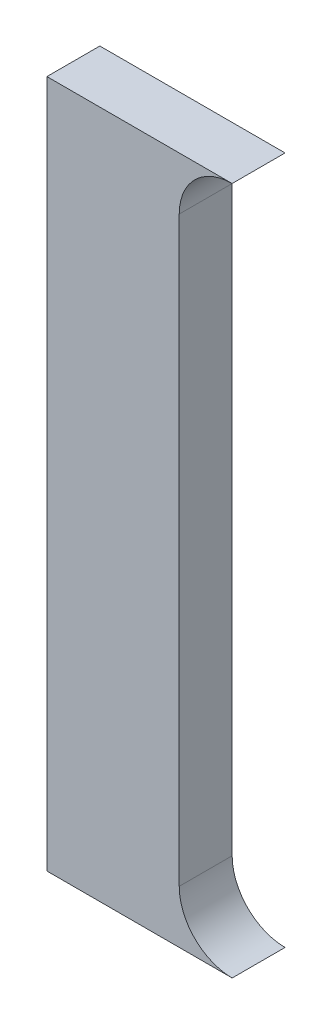
ISO-10303-21;
HEADER;
FILE_DESCRIPTION(('STEP AP214'),'2;1');
FILE_NAME('part.step','',(''),(''),'','','');
FILE_SCHEMA(('AUTOMOTIVE_DESIGN { 1 0 10303 214 1 1 1 1 }'));
ENDSEC;
DATA;
#1=APPLICATION_CONTEXT('core data for automotive mechanical design processes');
#2=APPLICATION_PROTOCOL_DEFINITION('international standard','automotive_design',2000,#1);
#3=PRODUCT_CONTEXT('',#1,'mechanical');
#4=PRODUCT('Part','Part','',(#3));
#5=PRODUCT_RELATED_PRODUCT_CATEGORY('part','',(#4));
#6=PRODUCT_DEFINITION_FORMATION('','',#4);
#7=PRODUCT_DEFINITION_CONTEXT('part definition',#1,'design');
#8=PRODUCT_DEFINITION('design','',#6,#7);
#9=PRODUCT_DEFINITION_SHAPE('','',#8);
#10=(LENGTH_UNIT() NAMED_UNIT(*) SI_UNIT(.MILLI.,.METRE.));
#11=(NAMED_UNIT(*) PLANE_ANGLE_UNIT() SI_UNIT($,.RADIAN.));
#12=(NAMED_UNIT(*) SI_UNIT($,.STERADIAN.) SOLID_ANGLE_UNIT());
#13=UNCERTAINTY_MEASURE_WITH_UNIT(LENGTH_MEASURE(1.E-05),#10,'distance_accuracy_value','');
#14=(GEOMETRIC_REPRESENTATION_CONTEXT(3) GLOBAL_UNCERTAINTY_ASSIGNED_CONTEXT((#13)) GLOBAL_UNIT_ASSIGNED_CONTEXT((#10,
#11,#12)) REPRESENTATION_CONTEXT('',''));
#15=CARTESIAN_POINT('',(0.,0.,0.));
#16=DIRECTION('',(0.,0.,1.));
#17=DIRECTION('',(1.,0.,0.));
#18=AXIS2_PLACEMENT_3D('',#15,#16,#17);
#19=CARTESIAN_POINT('',(15.875,-82.55,12.7));
#20=DIRECTION('',(-1.,0.,0.));
#21=DIRECTION('',(0.,0.,1.));
#22=AXIS2_PLACEMENT_3D('',#19,#20,#21);
#23=PLANE('',#22);
#24=DIRECTION('',(0.,1.,0.));
#25=VECTOR('',#24,1.);
#26=CARTESIAN_POINT('',(15.875,-82.55,12.7));
#27=LINE('',#26,#25);
#28=CARTESIAN_POINT('',(15.875,-69.85,12.7));
#29=VERTEX_POINT('',#28);
#30=CARTESIAN_POINT('',(15.875,69.85,12.7));
#31=VERTEX_POINT('',#30);
#32=EDGE_CURVE('E45',#29,#31,#27,.T.);
#33=ORIENTED_EDGE('',*,*,#32,.F.);
#34=DIRECTION('',(0.,0.,1.));
#35=VECTOR('',#34,1.);
#36=CARTESIAN_POINT('',(15.875,-69.85,-17.9605122421383));
#37=LINE('',#36,#35);
#38=CARTESIAN_POINT('',(15.875,-69.85,0.));
#39=VERTEX_POINT('',#38);
#40=EDGE_CURVE('E103',#39,#29,#37,.T.);
#41=ORIENTED_EDGE('',*,*,#40,.F.);
#42=DIRECTION('',(0.,1.,0.));
#43=VECTOR('',#42,1.);
#44=CARTESIAN_POINT('',(15.875,-82.55,0.));
#45=LINE('',#44,#43);
#46=CARTESIAN_POINT('',(15.875,69.85,0.));
#47=VERTEX_POINT('',#46);
#48=EDGE_CURVE('E118',#39,#47,#45,.T.);
#49=ORIENTED_EDGE('',*,*,#48,.T.);
#50=DIRECTION('',(0.,0.,1.));
#51=VECTOR('',#50,1.);
#52=CARTESIAN_POINT('',(15.875,69.85,-17.9605122421383));
#53=LINE('',#52,#51);
#54=EDGE_CURVE('E116',#47,#31,#53,.T.);
#55=ORIENTED_EDGE('',*,*,#54,.T.);
#56=EDGE_LOOP('',(#33,#41,#49,#55));
#57=FACE_BOUND('',#56,.T.);
#58=ADVANCED_FACE('F31',(#57),#23,.F.);
#59=CARTESIAN_POINT('',(-15.875,82.55,12.7));
#60=DIRECTION('',(0.,-1.,0.));
#61=DIRECTION('',(0.,0.,-1.));
#62=AXIS2_PLACEMENT_3D('',#59,#60,#61);
#63=PLANE('',#62);
#64=DIRECTION('',(-1.,0.,0.));
#65=VECTOR('',#64,1.);
#66=CARTESIAN_POINT('',(-15.875,82.55,0.));
#67=LINE('',#66,#65);
#68=CARTESIAN_POINT('',(28.575,82.55,0.));
#69=VERTEX_POINT('',#68);
#70=CARTESIAN_POINT('',(-15.875,82.55,0.));
#71=VERTEX_POINT('',#70);
#72=EDGE_CURVE('E124',#69,#71,#67,.T.);
#73=ORIENTED_EDGE('',*,*,#72,.T.);
#74=DIRECTION('',(0.,0.,-1.));
#75=VECTOR('',#74,1.);
#76=CARTESIAN_POINT('',(-15.875,82.55,12.7));
#77=LINE('',#76,#75);
#78=CARTESIAN_POINT('',(-15.875,82.55,12.7));
#79=VERTEX_POINT('',#78);
#80=EDGE_CURVE('E11',#79,#71,#77,.T.);
#81=ORIENTED_EDGE('',*,*,#80,.F.);
#82=DIRECTION('',(-1.,0.,0.));
#83=VECTOR('',#82,1.);
#84=CARTESIAN_POINT('',(-15.875,82.55,12.7));
#85=LINE('',#84,#83);
#86=CARTESIAN_POINT('',(28.575,82.55,12.7));
#87=VERTEX_POINT('',#86);
#88=EDGE_CURVE('E120',#87,#79,#85,.T.);
#89=ORIENTED_EDGE('',*,*,#88,.F.);
#90=DIRECTION('',(0.,0.,1.));
#91=VECTOR('',#90,1.);
#92=CARTESIAN_POINT('',(28.575,82.55,-17.9605122421383));
#93=LINE('',#92,#91);
#94=EDGE_CURVE('E113',#69,#87,#93,.T.);
#95=ORIENTED_EDGE('',*,*,#94,.F.);
#96=EDGE_LOOP('',(#73,#81,#89,#95));
#97=FACE_BOUND('',#96,.T.);
#98=ADVANCED_FACE('F135',(#97),#63,.F.);
#99=CARTESIAN_POINT('',(-15.875,-82.55,12.7));
#100=DIRECTION('',(1.,0.,0.));
#101=DIRECTION('',(0.,0.,-1.));
#102=AXIS2_PLACEMENT_3D('',#99,#100,#101);
#103=PLANE('',#102);
#104=DIRECTION('',(0.,-1.,0.));
#105=VECTOR('',#104,1.);
#106=CARTESIAN_POINT('',(-15.875,-82.55,0.));
#107=LINE('',#106,#105);
#108=CARTESIAN_POINT('',(-15.875,-82.55,0.));
#109=VERTEX_POINT('',#108);
#110=EDGE_CURVE('E126',#71,#109,#107,.T.);
#111=ORIENTED_EDGE('',*,*,#110,.T.);
#112=DIRECTION('',(0.,0.,-1.));
#113=VECTOR('',#112,1.);
#114=CARTESIAN_POINT('',(-15.875,-82.55,12.7));
#115=LINE('',#114,#113);
#116=CARTESIAN_POINT('',(-15.875,-82.55,12.7));
#117=VERTEX_POINT('',#116);
#118=EDGE_CURVE('E38',#117,#109,#115,.T.);
#119=ORIENTED_EDGE('',*,*,#118,.F.);
#120=DIRECTION('',(0.,-1.,0.));
#121=VECTOR('',#120,1.);
#122=CARTESIAN_POINT('',(-15.875,-82.55,12.7));
#123=LINE('',#122,#121);
#124=EDGE_CURVE('E87',#79,#117,#123,.T.);
#125=ORIENTED_EDGE('',*,*,#124,.F.);
#126=ORIENTED_EDGE('',*,*,#80,.T.);
#127=EDGE_LOOP('',(#111,#119,#125,#126));
#128=FACE_BOUND('',#127,.T.);
#129=ADVANCED_FACE('F141',(#128),#103,.F.);
#130=CARTESIAN_POINT('',(-15.875,-82.55,12.7));
#131=DIRECTION('',(0.,1.,0.));
#132=DIRECTION('',(0.,0.,1.));
#133=AXIS2_PLACEMENT_3D('',#130,#131,#132);
#134=PLANE('',#133);
#135=DIRECTION('',(1.,0.,0.));
#136=VECTOR('',#135,1.);
#137=CARTESIAN_POINT('',(-15.875,-82.55,0.));
#138=LINE('',#137,#136);
#139=CARTESIAN_POINT('',(28.575,-82.55,0.));
#140=VERTEX_POINT('',#139);
#141=EDGE_CURVE('E96',#109,#140,#138,.T.);
#142=ORIENTED_EDGE('',*,*,#141,.T.);
#143=DIRECTION('',(0.,0.,1.));
#144=VECTOR('',#143,1.);
#145=CARTESIAN_POINT('',(28.575,-82.55,-17.9605122421383));
#146=LINE('',#145,#144);
#147=CARTESIAN_POINT('',(28.575,-82.55,12.7));
#148=VERTEX_POINT('',#147);
#149=EDGE_CURVE('E93',#140,#148,#146,.T.);
#150=ORIENTED_EDGE('',*,*,#149,.T.);
#151=DIRECTION('',(1.,0.,0.));
#152=VECTOR('',#151,1.);
#153=CARTESIAN_POINT('',(-15.875,-82.55,12.7));
#154=LINE('',#153,#152);
#155=EDGE_CURVE('E81',#117,#148,#154,.T.);
#156=ORIENTED_EDGE('',*,*,#155,.F.);
#157=ORIENTED_EDGE('',*,*,#118,.T.);
#158=EDGE_LOOP('',(#142,#150,#156,#157));
#159=FACE_BOUND('',#158,.T.);
#160=ADVANCED_FACE('F94',(#159),#134,.F.);
#161=CARTESIAN_POINT('',(15.875,82.55,12.7));
#162=DIRECTION('',(0.,0.,-1.));
#163=DIRECTION('',(-1.,0.,0.));
#164=AXIS2_PLACEMENT_3D('',#161,#162,#163);
#165=PLANE('',#164);
#166=ORIENTED_EDGE('',*,*,#155,.T.);
#167=CARTESIAN_POINT('',(28.575,-69.85,12.7));
#168=DIRECTION('',(0.,0.,-1.));
#169=DIRECTION('',(-1.,0.,0.));
#170=AXIS2_PLACEMENT_3D('',#167,#168,#169);
#171=CIRCLE('',#170,12.7);
#172=EDGE_CURVE('E85',#148,#29,#171,.T.);
#173=ORIENTED_EDGE('',*,*,#172,.T.);
#174=ORIENTED_EDGE('',*,*,#32,.T.);
#175=CARTESIAN_POINT('',(28.575,69.85,12.7));
#176=DIRECTION('',(0.,0.,-1.));
#177=DIRECTION('',(1.,0.,0.));
#178=AXIS2_PLACEMENT_3D('',#175,#176,#177);
#179=CIRCLE('',#178,12.7);
#180=EDGE_CURVE('E108',#31,#87,#179,.T.);
#181=ORIENTED_EDGE('',*,*,#180,.T.);
#182=ORIENTED_EDGE('',*,*,#88,.T.);
#183=ORIENTED_EDGE('',*,*,#124,.T.);
#184=EDGE_LOOP('',(#166,#173,#174,#181,#182,#183));
#185=FACE_BOUND('',#184,.T.);
#186=ADVANCED_FACE('F83',(#185),#165,.F.);
#187=CARTESIAN_POINT('',(15.875,82.55,0.));
#188=DIRECTION('',(0.,0.,-1.));
#189=DIRECTION('',(-1.,0.,0.));
#190=AXIS2_PLACEMENT_3D('',#187,#188,#189);
#191=PLANE('',#190);
#192=ORIENTED_EDGE('',*,*,#48,.F.);
#193=CARTESIAN_POINT('',(28.575,-69.85,0.));
#194=DIRECTION('',(0.,0.,-1.));
#195=DIRECTION('',(-1.,0.,0.));
#196=AXIS2_PLACEMENT_3D('',#193,#194,#195);
#197=CIRCLE('',#196,12.7);
#198=EDGE_CURVE('E100',#140,#39,#197,.T.);
#199=ORIENTED_EDGE('',*,*,#198,.F.);
#200=ORIENTED_EDGE('',*,*,#141,.F.);
#201=ORIENTED_EDGE('',*,*,#110,.F.);
#202=ORIENTED_EDGE('',*,*,#72,.F.);
#203=CARTESIAN_POINT('',(28.575,69.85,0.));
#204=DIRECTION('',(0.,0.,-1.));
#205=DIRECTION('',(-1.,0.,0.));
#206=AXIS2_PLACEMENT_3D('',#203,#204,#205);
#207=CIRCLE('',#206,12.7);
#208=EDGE_CURVE('E110',#47,#69,#207,.T.);
#209=ORIENTED_EDGE('',*,*,#208,.F.);
#210=EDGE_LOOP('',(#192,#199,#200,#201,#202,#209));
#211=FACE_BOUND('',#210,.T.);
#212=ADVANCED_FACE('F131',(#211),#191,.T.);
#213=CARTESIAN_POINT('',(28.575,69.85,-17.9605122421383));
#214=DIRECTION('',(0.,0.,1.));
#215=DIRECTION('',(1.,0.,0.));
#216=AXIS2_PLACEMENT_3D('',#213,#214,#215);
#217=CYLINDRICAL_SURFACE('',#216,12.7);
#218=ORIENTED_EDGE('',*,*,#54,.F.);
#219=ORIENTED_EDGE('',*,*,#208,.T.);
#220=ORIENTED_EDGE('',*,*,#94,.T.);
#221=ORIENTED_EDGE('',*,*,#180,.F.);
#222=EDGE_LOOP('',(#218,#219,#220,#221));
#223=FACE_BOUND('',#222,.T.);
#224=ADVANCED_FACE('F152',(#223),#217,.F.);
#225=CARTESIAN_POINT('',(28.575,-69.85,-17.9605122421383));
#226=DIRECTION('',(0.,0.,1.));
#227=DIRECTION('',(1.,0.,0.));
#228=AXIS2_PLACEMENT_3D('',#225,#226,#227);
#229=CYLINDRICAL_SURFACE('',#228,12.7);
#230=ORIENTED_EDGE('',*,*,#149,.F.);
#231=ORIENTED_EDGE('',*,*,#198,.T.);
#232=ORIENTED_EDGE('',*,*,#40,.T.);
#233=ORIENTED_EDGE('',*,*,#172,.F.);
#234=EDGE_LOOP('',(#230,#231,#232,#233));
#235=FACE_BOUND('',#234,.T.);
#236=ADVANCED_FACE('F102',(#235),#229,.F.);
#237=CLOSED_SHELL('',(#58,#98,#129,#160,#186,#212,#224,#236));
#238=MANIFOLD_SOLID_BREP('B2',#237);
#239=ADVANCED_BREP_SHAPE_REPRESENTATION('',(#18,#238),#14);
#240=SHAPE_DEFINITION_REPRESENTATION(#9,#239);
ENDSEC;
END-ISO-10303-21;
